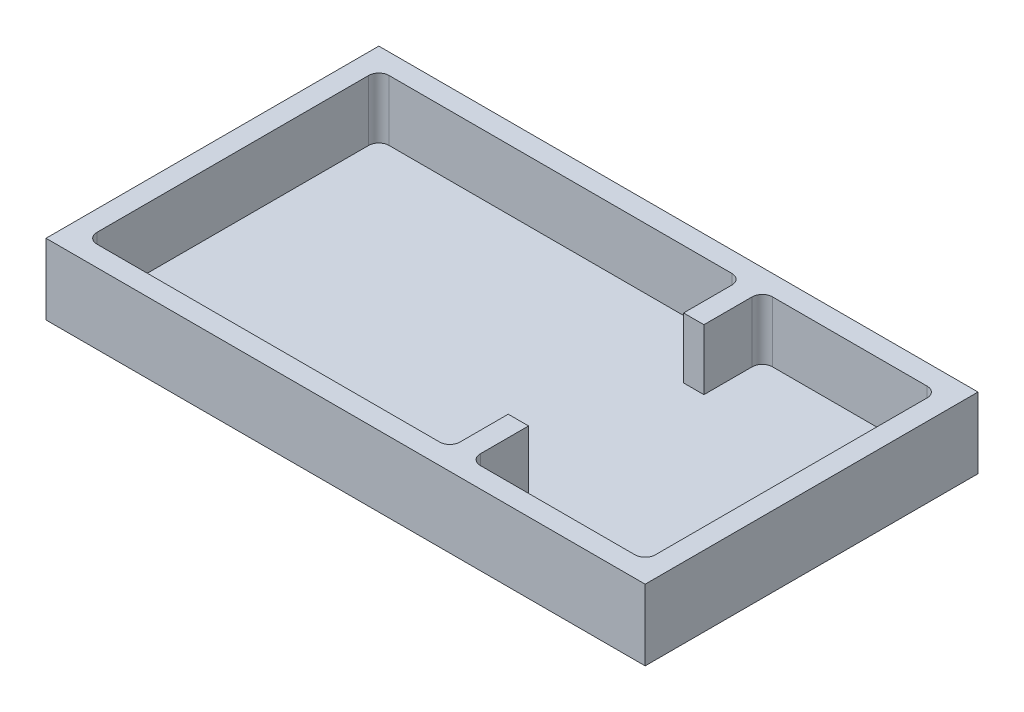
ISO-10303-21;
HEADER;
FILE_DESCRIPTION(('STEP AP214'),'2;1');
FILE_NAME('part.step','',(''),(''),'','','');
FILE_SCHEMA(('AUTOMOTIVE_DESIGN { 1 0 10303 214 1 1 1 1 }'));
ENDSEC;
DATA;
#1=APPLICATION_CONTEXT('core data for automotive mechanical design processes');
#2=APPLICATION_PROTOCOL_DEFINITION('international standard','automotive_design',2000,#1);
#3=PRODUCT_CONTEXT('',#1,'mechanical');
#4=PRODUCT('Part','Part','',(#3));
#5=PRODUCT_RELATED_PRODUCT_CATEGORY('part','',(#4));
#6=PRODUCT_DEFINITION_FORMATION('','',#4);
#7=PRODUCT_DEFINITION_CONTEXT('part definition',#1,'design');
#8=PRODUCT_DEFINITION('design','',#6,#7);
#9=PRODUCT_DEFINITION_SHAPE('','',#8);
#10=(LENGTH_UNIT() NAMED_UNIT(*) SI_UNIT(.MILLI.,.METRE.));
#11=(NAMED_UNIT(*) PLANE_ANGLE_UNIT() SI_UNIT($,.RADIAN.));
#12=(NAMED_UNIT(*) SI_UNIT($,.STERADIAN.) SOLID_ANGLE_UNIT());
#13=UNCERTAINTY_MEASURE_WITH_UNIT(LENGTH_MEASURE(1.E-05),#10,'distance_accuracy_value','');
#14=(GEOMETRIC_REPRESENTATION_CONTEXT(3) GLOBAL_UNCERTAINTY_ASSIGNED_CONTEXT((#13)) GLOBAL_UNIT_ASSIGNED_CONTEXT((#10,
#11,#12)) REPRESENTATION_CONTEXT('',''));
#15=CARTESIAN_POINT('',(0.,0.,0.));
#16=DIRECTION('',(0.,0.,1.));
#17=DIRECTION('',(1.,0.,0.));
#18=AXIS2_PLACEMENT_3D('',#15,#16,#17);
#19=CARTESIAN_POINT('',(0.,18.923,-103.910500649562));
#20=DIRECTION('',(0.,-1.,0.));
#21=DIRECTION('',(0.,0.,-1.));
#22=AXIS2_PLACEMENT_3D('',#19,#20,#21);
#23=PLANE('',#22);
#24=DIRECTION('',(0.,0.,1.));
#25=VECTOR('',#24,1.);
#26=CARTESIAN_POINT('',(0.,18.923,0.));
#27=LINE('',#26,#25);
#28=CARTESIAN_POINT('',(0.,18.923,-103.910500649562));
#29=VERTEX_POINT('',#28);
#30=CARTESIAN_POINT('',(0.,18.923,0.));
#31=VERTEX_POINT('',#30);
#32=EDGE_CURVE('E356',#29,#31,#27,.T.);
#33=ORIENTED_EDGE('',*,*,#32,.T.);
#34=DIRECTION('',(1.,0.,0.));
#35=VECTOR('',#34,1.);
#36=CARTESIAN_POINT('',(0.,18.923,0.));
#37=LINE('',#36,#35);
#38=CARTESIAN_POINT('',(187.051787580175,18.923,0.));
#39=VERTEX_POINT('',#38);
#40=EDGE_CURVE('E196',#31,#39,#37,.T.);
#41=ORIENTED_EDGE('',*,*,#40,.T.);
#42=DIRECTION('',(0.,0.,-1.));
#43=VECTOR('',#42,1.);
#44=CARTESIAN_POINT('',(187.051787580175,18.923,0.));
#45=LINE('',#44,#43);
#46=CARTESIAN_POINT('',(187.051787580175,18.923,-103.910500649562));
#47=VERTEX_POINT('',#46);
#48=EDGE_CURVE('E359',#39,#47,#45,.T.);
#49=ORIENTED_EDGE('',*,*,#48,.T.);
#50=DIRECTION('',(-1.,0.,0.));
#51=VECTOR('',#50,1.);
#52=CARTESIAN_POINT('',(0.,18.923,-103.910500649562));
#53=LINE('',#52,#51);
#54=EDGE_CURVE('E54',#47,#29,#53,.T.);
#55=ORIENTED_EDGE('',*,*,#54,.T.);
#56=EDGE_LOOP('',(#33,#41,#49,#55));
#57=FACE_BOUND('',#56,.T.);
#58=CARTESIAN_POINT('',(116.541319733707,18.923,-94.3855006495616));
#59=DIRECTION('',(0.,1.,0.));
#60=DIRECTION('',(0.,0.,1.));
#61=AXIS2_PLACEMENT_3D('',#58,#59,#60);
#62=CIRCLE('',#61,3.175);
#63=CARTESIAN_POINT('',(119.716319733707,18.923,-94.3855006495616));
#64=VERTEX_POINT('',#63);
#65=CARTESIAN_POINT('',(116.541319733707,18.923,-97.5605006495616));
#66=VERTEX_POINT('',#65);
#67=EDGE_CURVE('E217',#64,#66,#62,.T.);
#68=ORIENTED_EDGE('',*,*,#67,.F.);
#69=DIRECTION('',(0.,0.,-1.));
#70=VECTOR('',#69,1.);
#71=CARTESIAN_POINT('',(119.716319733707,18.923,-94.3855006495616));
#72=LINE('',#71,#70);
#73=CARTESIAN_POINT('',(119.716319733707,18.923,-79.325148105454));
#74=VERTEX_POINT('',#73);
#75=EDGE_CURVE('E256',#74,#64,#72,.T.);
#76=ORIENTED_EDGE('',*,*,#75,.F.);
#77=DIRECTION('',(-1.,0.,0.));
#78=VECTOR('',#77,1.);
#79=CARTESIAN_POINT('',(126.066319733707,18.923,-79.325148105454));
#80=LINE('',#79,#78);
#81=CARTESIAN_POINT('',(126.066319733707,18.923,-79.325148105454));
#82=VERTEX_POINT('',#81);
#83=EDGE_CURVE('E254',#82,#74,#80,.T.);
#84=ORIENTED_EDGE('',*,*,#83,.F.);
#85=DIRECTION('',(0.,0.,1.));
#86=VECTOR('',#85,1.);
#87=CARTESIAN_POINT('',(126.066319733707,18.923,-94.3855006495616));
#88=LINE('',#87,#86);
#89=CARTESIAN_POINT('',(126.066319733707,18.923,-94.3855006495616));
#90=VERTEX_POINT('',#89);
#91=EDGE_CURVE('E252',#90,#82,#88,.T.);
#92=ORIENTED_EDGE('',*,*,#91,.F.);
#93=CARTESIAN_POINT('',(129.241319733707,18.923,-94.3855006495616));
#94=DIRECTION('',(0.,1.,0.));
#95=DIRECTION('',(0.,0.,1.));
#96=AXIS2_PLACEMENT_3D('',#93,#94,#95);
#97=CIRCLE('',#96,3.175);
#98=CARTESIAN_POINT('',(129.241319733707,18.923,-97.5605006495616));
#99=VERTEX_POINT('',#98);
#100=EDGE_CURVE('E250',#99,#90,#97,.T.);
#101=ORIENTED_EDGE('',*,*,#100,.F.);
#102=DIRECTION('',(-1.,0.,0.));
#103=VECTOR('',#102,1.);
#104=CARTESIAN_POINT('',(129.241319733707,18.923,-97.5605006495616));
#105=LINE('',#104,#103);
#106=CARTESIAN_POINT('',(177.526787580175,18.923,-97.5605006495616));
#107=VERTEX_POINT('',#106);
#108=EDGE_CURVE('E248',#107,#99,#105,.T.);
#109=ORIENTED_EDGE('',*,*,#108,.F.);
#110=CARTESIAN_POINT('',(177.526787580175,18.923,-94.3855006495616));
#111=DIRECTION('',(0.,1.,0.));
#112=DIRECTION('',(0.,0.,1.));
#113=AXIS2_PLACEMENT_3D('',#110,#111,#112);
#114=CIRCLE('',#113,3.175);
#115=CARTESIAN_POINT('',(180.701787580175,18.923,-94.3855006495616));
#116=VERTEX_POINT('',#115);
#117=EDGE_CURVE('E246',#116,#107,#114,.T.);
#118=ORIENTED_EDGE('',*,*,#117,.F.);
#119=DIRECTION('',(0.,0.,-1.));
#120=VECTOR('',#119,1.);
#121=CARTESIAN_POINT('',(180.701787580175,18.923,-9.52500000000002));
#122=LINE('',#121,#120);
#123=CARTESIAN_POINT('',(180.701787580175,18.923,-9.52500000000002));
#124=VERTEX_POINT('',#123);
#125=EDGE_CURVE('E244',#124,#116,#122,.T.);
#126=ORIENTED_EDGE('',*,*,#125,.F.);
#127=CARTESIAN_POINT('',(177.526787580175,18.923,-9.525));
#128=DIRECTION('',(0.,1.,0.));
#129=DIRECTION('',(0.,0.,-1.));
#130=AXIS2_PLACEMENT_3D('',#127,#128,#129);
#131=CIRCLE('',#130,3.17500000000001);
#132=CARTESIAN_POINT('',(177.526787580175,18.923,-6.34999999999999));
#133=VERTEX_POINT('',#132);
#134=EDGE_CURVE('E242',#133,#124,#131,.T.);
#135=ORIENTED_EDGE('',*,*,#134,.F.);
#136=DIRECTION('',(1.,0.,0.));
#137=VECTOR('',#136,1.);
#138=CARTESIAN_POINT('',(129.241319733707,18.923,-6.34999999999999));
#139=LINE('',#138,#137);
#140=CARTESIAN_POINT('',(129.241319733707,18.923,-6.34999999999999));
#141=VERTEX_POINT('',#140);
#142=EDGE_CURVE('E240',#141,#133,#139,.T.);
#143=ORIENTED_EDGE('',*,*,#142,.F.);
#144=CARTESIAN_POINT('',(129.241319733707,18.923,-9.52499999999999));
#145=DIRECTION('',(0.,1.,0.));
#146=DIRECTION('',(0.,0.,-1.));
#147=AXIS2_PLACEMENT_3D('',#144,#145,#146);
#148=CIRCLE('',#147,3.175);
#149=CARTESIAN_POINT('',(126.066319733707,18.923,-9.52500000000002));
#150=VERTEX_POINT('',#149);
#151=EDGE_CURVE('E238',#150,#141,#148,.T.);
#152=ORIENTED_EDGE('',*,*,#151,.F.);
#153=DIRECTION('',(0.,0.,1.));
#154=VECTOR('',#153,1.);
#155=CARTESIAN_POINT('',(126.066319733707,18.923,-9.52500000000002));
#156=LINE('',#155,#154);
#157=CARTESIAN_POINT('',(126.066319733707,18.923,-24.5853525441077));
#158=VERTEX_POINT('',#157);
#159=EDGE_CURVE('E236',#158,#150,#156,.T.);
#160=ORIENTED_EDGE('',*,*,#159,.F.);
#161=DIRECTION('',(1.,0.,0.));
#162=VECTOR('',#161,1.);
#163=CARTESIAN_POINT('',(126.066319733707,18.923,-24.5853525441077));
#164=LINE('',#163,#162);
#165=CARTESIAN_POINT('',(119.716319733707,18.923,-24.5853525441077));
#166=VERTEX_POINT('',#165);
#167=EDGE_CURVE('E234',#166,#158,#164,.T.);
#168=ORIENTED_EDGE('',*,*,#167,.F.);
#169=DIRECTION('',(0.,0.,-1.));
#170=VECTOR('',#169,1.);
#171=CARTESIAN_POINT('',(119.716319733707,18.923,-9.52500000000002));
#172=LINE('',#171,#170);
#173=CARTESIAN_POINT('',(119.716319733707,18.923,-9.52500000000002));
#174=VERTEX_POINT('',#173);
#175=EDGE_CURVE('E232',#174,#166,#172,.T.);
#176=ORIENTED_EDGE('',*,*,#175,.F.);
#177=CARTESIAN_POINT('',(116.541319733707,18.923,-9.52499999999999));
#178=DIRECTION('',(0.,1.,0.));
#179=DIRECTION('',(0.,0.,-1.));
#180=AXIS2_PLACEMENT_3D('',#177,#178,#179);
#181=CIRCLE('',#180,3.175);
#182=CARTESIAN_POINT('',(116.541319733707,18.923,-6.34999999999999));
#183=VERTEX_POINT('',#182);
#184=EDGE_CURVE('E230',#183,#174,#181,.T.);
#185=ORIENTED_EDGE('',*,*,#184,.F.);
#186=DIRECTION('',(1.,0.,0.));
#187=VECTOR('',#186,1.);
#188=CARTESIAN_POINT('',(9.52500000000002,18.923,-6.35));
#189=LINE('',#188,#187);
#190=CARTESIAN_POINT('',(9.52500000000002,18.923,-6.35));
#191=VERTEX_POINT('',#190);
#192=EDGE_CURVE('E228',#191,#183,#189,.T.);
#193=ORIENTED_EDGE('',*,*,#192,.F.);
#194=CARTESIAN_POINT('',(9.525,18.923,-9.525));
#195=DIRECTION('',(0.,1.,0.));
#196=DIRECTION('',(0.,0.,-1.));
#197=AXIS2_PLACEMENT_3D('',#194,#195,#196);
#198=CIRCLE('',#197,3.175);
#199=CARTESIAN_POINT('',(6.35,18.923,-9.52500000000002));
#200=VERTEX_POINT('',#199);
#201=EDGE_CURVE('E226',#200,#191,#198,.T.);
#202=ORIENTED_EDGE('',*,*,#201,.F.);
#203=DIRECTION('',(0.,0.,1.));
#204=VECTOR('',#203,1.);
#205=CARTESIAN_POINT('',(6.35,18.923,-9.52500000000002));
#206=LINE('',#205,#204);
#207=CARTESIAN_POINT('',(6.35,18.923,-94.3855006495616));
#208=VERTEX_POINT('',#207);
#209=EDGE_CURVE('E224',#208,#200,#206,.T.);
#210=ORIENTED_EDGE('',*,*,#209,.F.);
#211=CARTESIAN_POINT('',(9.525,18.923,-94.3855006495616));
#212=DIRECTION('',(0.,1.,0.));
#213=DIRECTION('',(0.,0.,-1.));
#214=AXIS2_PLACEMENT_3D('',#211,#212,#213);
#215=CIRCLE('',#214,3.175);
#216=CARTESIAN_POINT('',(9.52500000000003,18.923,-97.5605006495616));
#217=VERTEX_POINT('',#216);
#218=EDGE_CURVE('E222',#217,#208,#215,.T.);
#219=ORIENTED_EDGE('',*,*,#218,.F.);
#220=DIRECTION('',(-1.,0.,0.));
#221=VECTOR('',#220,1.);
#222=CARTESIAN_POINT('',(9.52500000000002,18.923,-97.5605006495616));
#223=LINE('',#222,#221);
#224=EDGE_CURVE('E219',#66,#217,#223,.T.);
#225=ORIENTED_EDGE('',*,*,#224,.F.);
#226=EDGE_LOOP('',(#68,#76,#84,#92,#101,#109,#118,#126,#135,#143,#152,#160,#168,#176,#185,#193,
#202,#210,#219,#225));
#227=FACE_BOUND('',#226,.T.);
#228=ADVANCED_FACE('F31',(#57,#227),#23,.F.);
#229=CARTESIAN_POINT('',(0.,18.923,0.));
#230=DIRECTION('',(1.,0.,0.));
#231=DIRECTION('',(0.,0.,-1.));
#232=AXIS2_PLACEMENT_3D('',#229,#230,#231);
#233=PLANE('',#232);
#234=DIRECTION('',(0.,-1.,0.));
#235=VECTOR('',#234,1.);
#236=CARTESIAN_POINT('',(0.,18.923,-103.910500649562));
#237=LINE('',#236,#235);
#238=CARTESIAN_POINT('',(0.,-3.175,-103.910500649562));
#239=VERTEX_POINT('',#238);
#240=EDGE_CURVE('E210',#29,#239,#237,.T.);
#241=ORIENTED_EDGE('',*,*,#240,.T.);
#242=DIRECTION('',(0.,0.,1.));
#243=VECTOR('',#242,1.);
#244=CARTESIAN_POINT('',(0.,-3.175,-103.910500649562));
#245=LINE('',#244,#243);
#246=CARTESIAN_POINT('',(0.,-3.175,0.));
#247=VERTEX_POINT('',#246);
#248=EDGE_CURVE('E205',#239,#247,#245,.T.);
#249=ORIENTED_EDGE('',*,*,#248,.T.);
#250=DIRECTION('',(0.,-1.,0.));
#251=VECTOR('',#250,1.);
#252=CARTESIAN_POINT('',(0.,18.923,0.));
#253=LINE('',#252,#251);
#254=EDGE_CURVE('E11',#31,#247,#253,.T.);
#255=ORIENTED_EDGE('',*,*,#254,.F.);
#256=ORIENTED_EDGE('',*,*,#32,.F.);
#257=EDGE_LOOP('',(#241,#249,#255,#256));
#258=FACE_BOUND('',#257,.T.);
#259=ADVANCED_FACE('F33',(#258),#233,.F.);
#260=CARTESIAN_POINT('',(0.,18.923,0.));
#261=DIRECTION('',(0.,0.,-1.));
#262=DIRECTION('',(-1.,0.,0.));
#263=AXIS2_PLACEMENT_3D('',#260,#261,#262);
#264=PLANE('',#263);
#265=ORIENTED_EDGE('',*,*,#254,.T.);
#266=DIRECTION('',(1.,0.,0.));
#267=VECTOR('',#266,1.);
#268=CARTESIAN_POINT('',(0.,-3.175,0.));
#269=LINE('',#268,#267);
#270=CARTESIAN_POINT('',(187.051787580175,-3.175,0.));
#271=VERTEX_POINT('',#270);
#272=EDGE_CURVE('E195',#247,#271,#269,.T.);
#273=ORIENTED_EDGE('',*,*,#272,.T.);
#274=DIRECTION('',(0.,-1.,0.));
#275=VECTOR('',#274,1.);
#276=CARTESIAN_POINT('',(187.051787580175,18.923,0.));
#277=LINE('',#276,#275);
#278=EDGE_CURVE('E39',#39,#271,#277,.T.);
#279=ORIENTED_EDGE('',*,*,#278,.F.);
#280=ORIENTED_EDGE('',*,*,#40,.F.);
#281=EDGE_LOOP('',(#265,#273,#279,#280));
#282=FACE_BOUND('',#281,.T.);
#283=ADVANCED_FACE('F193',(#282),#264,.F.);
#284=CARTESIAN_POINT('',(187.051787580175,18.923,0.));
#285=DIRECTION('',(-1.,0.,0.));
#286=DIRECTION('',(0.,0.,1.));
#287=AXIS2_PLACEMENT_3D('',#284,#285,#286);
#288=PLANE('',#287);
#289=ORIENTED_EDGE('',*,*,#278,.T.);
#290=DIRECTION('',(0.,0.,-1.));
#291=VECTOR('',#290,1.);
#292=CARTESIAN_POINT('',(187.051787580175,-3.175,-103.910500649562));
#293=LINE('',#292,#291);
#294=CARTESIAN_POINT('',(187.051787580175,-3.175,-103.910500649562));
#295=VERTEX_POINT('',#294);
#296=EDGE_CURVE('E208',#271,#295,#293,.T.);
#297=ORIENTED_EDGE('',*,*,#296,.T.);
#298=DIRECTION('',(0.,-1.,0.));
#299=VECTOR('',#298,1.);
#300=CARTESIAN_POINT('',(187.051787580175,18.923,-103.910500649562));
#301=LINE('',#300,#299);
#302=EDGE_CURVE('E363',#47,#295,#301,.T.);
#303=ORIENTED_EDGE('',*,*,#302,.F.);
#304=ORIENTED_EDGE('',*,*,#48,.F.);
#305=EDGE_LOOP('',(#289,#297,#303,#304));
#306=FACE_BOUND('',#305,.T.);
#307=ADVANCED_FACE('F366',(#306),#288,.F.);
#308=CARTESIAN_POINT('',(0.,18.923,-103.910500649562));
#309=DIRECTION('',(0.,0.,1.));
#310=DIRECTION('',(1.,0.,0.));
#311=AXIS2_PLACEMENT_3D('',#308,#309,#310);
#312=PLANE('',#311);
#313=ORIENTED_EDGE('',*,*,#302,.T.);
#314=DIRECTION('',(-1.,0.,0.));
#315=VECTOR('',#314,1.);
#316=CARTESIAN_POINT('',(0.,-3.175,-103.910500649562));
#317=LINE('',#316,#315);
#318=EDGE_CURVE('E214',#295,#239,#317,.T.);
#319=ORIENTED_EDGE('',*,*,#318,.T.);
#320=ORIENTED_EDGE('',*,*,#240,.F.);
#321=ORIENTED_EDGE('',*,*,#54,.F.);
#322=EDGE_LOOP('',(#313,#319,#320,#321));
#323=FACE_BOUND('',#322,.T.);
#324=ADVANCED_FACE('F468',(#323),#312,.F.);
#325=CARTESIAN_POINT('',(116.541319733707,18.923,-94.3855006495616));
#326=DIRECTION('',(0.,-1.,0.));
#327=DIRECTION('',(0.,0.,-1.));
#328=AXIS2_PLACEMENT_3D('',#325,#326,#327);
#329=CYLINDRICAL_SURFACE('',#328,3.175);
#330=CARTESIAN_POINT('',(116.541319733707,0.,-94.3855006495616));
#331=DIRECTION('',(0.,1.,0.));
#332=DIRECTION('',(0.,0.,1.));
#333=AXIS2_PLACEMENT_3D('',#330,#331,#332);
#334=CIRCLE('',#333,3.175);
#335=CARTESIAN_POINT('',(119.716319733707,0.,-94.3855006495616));
#336=VERTEX_POINT('',#335);
#337=CARTESIAN_POINT('',(116.541319733707,0.,-97.5605006495616));
#338=VERTEX_POINT('',#337);
#339=EDGE_CURVE('E216',#336,#338,#334,.T.);
#340=ORIENTED_EDGE('',*,*,#339,.F.);
#341=DIRECTION('',(0.,-1.,0.));
#342=VECTOR('',#341,1.);
#343=CARTESIAN_POINT('',(119.716319733707,18.923,-94.3855006495616));
#344=LINE('',#343,#342);
#345=EDGE_CURVE('E258',#64,#336,#344,.T.);
#346=ORIENTED_EDGE('',*,*,#345,.F.);
#347=ORIENTED_EDGE('',*,*,#67,.T.);
#348=DIRECTION('',(0.,-1.,0.));
#349=VECTOR('',#348,1.);
#350=CARTESIAN_POINT('',(116.541319733707,18.923,-97.5605006495616));
#351=LINE('',#350,#349);
#352=EDGE_CURVE('E353',#66,#338,#351,.T.);
#353=ORIENTED_EDGE('',*,*,#352,.T.);
#354=EDGE_LOOP('',(#340,#346,#347,#353));
#355=FACE_BOUND('',#354,.T.);
#356=ADVANCED_FACE('F380',(#355),#329,.F.);
#357=CARTESIAN_POINT('',(9.52500000000002,18.923,-97.5605006495616));
#358=DIRECTION('',(0.,0.,1.));
#359=DIRECTION('',(1.,0.,0.));
#360=AXIS2_PLACEMENT_3D('',#357,#358,#359);
#361=PLANE('',#360);
#362=DIRECTION('',(-1.,0.,0.));
#363=VECTOR('',#362,1.);
#364=CARTESIAN_POINT('',(9.52500000000002,0.,-97.5605006495616));
#365=LINE('',#364,#363);
#366=CARTESIAN_POINT('',(9.52500000000003,0.,-97.5605006495616));
#367=VERTEX_POINT('',#366);
#368=EDGE_CURVE('E261',#338,#367,#365,.T.);
#369=ORIENTED_EDGE('',*,*,#368,.F.);
#370=ORIENTED_EDGE('',*,*,#352,.F.);
#371=ORIENTED_EDGE('',*,*,#224,.T.);
#372=DIRECTION('',(0.,-1.,0.));
#373=VECTOR('',#372,1.);
#374=CARTESIAN_POINT('',(9.52500000000003,18.923,-97.5605006495616));
#375=LINE('',#374,#373);
#376=EDGE_CURVE('E351',#217,#367,#375,.T.);
#377=ORIENTED_EDGE('',*,*,#376,.T.);
#378=EDGE_LOOP('',(#369,#370,#371,#377));
#379=FACE_BOUND('',#378,.T.);
#380=ADVANCED_FACE('F382',(#379),#361,.T.);
#381=CARTESIAN_POINT('',(9.525,18.923,-94.3855006495616));
#382=DIRECTION('',(0.,-1.,0.));
#383=DIRECTION('',(0.,0.,-1.));
#384=AXIS2_PLACEMENT_3D('',#381,#382,#383);
#385=CYLINDRICAL_SURFACE('',#384,3.175);
#386=CARTESIAN_POINT('',(9.525,0.,-94.3855006495616));
#387=DIRECTION('',(0.,1.,0.));
#388=DIRECTION('',(0.,0.,-1.));
#389=AXIS2_PLACEMENT_3D('',#386,#387,#388);
#390=CIRCLE('',#389,3.175);
#391=CARTESIAN_POINT('',(6.35,0.,-94.3855006495616));
#392=VERTEX_POINT('',#391);
#393=EDGE_CURVE('E264',#367,#392,#390,.T.);
#394=ORIENTED_EDGE('',*,*,#393,.F.);
#395=ORIENTED_EDGE('',*,*,#376,.F.);
#396=ORIENTED_EDGE('',*,*,#218,.T.);
#397=DIRECTION('',(0.,-1.,0.));
#398=VECTOR('',#397,1.);
#399=CARTESIAN_POINT('',(6.35,18.923,-94.3855006495616));
#400=LINE('',#399,#398);
#401=EDGE_CURVE('E349',#208,#392,#400,.T.);
#402=ORIENTED_EDGE('',*,*,#401,.T.);
#403=EDGE_LOOP('',(#394,#395,#396,#402));
#404=FACE_BOUND('',#403,.T.);
#405=ADVANCED_FACE('F460',(#404),#385,.F.);
#406=CARTESIAN_POINT('',(6.35,18.923,-9.52500000000002));
#407=DIRECTION('',(1.,0.,0.));
#408=DIRECTION('',(0.,0.,-1.));
#409=AXIS2_PLACEMENT_3D('',#406,#407,#408);
#410=PLANE('',#409);
#411=DIRECTION('',(0.,0.,1.));
#412=VECTOR('',#411,1.);
#413=CARTESIAN_POINT('',(6.35,0.,-9.52500000000002));
#414=LINE('',#413,#412);
#415=CARTESIAN_POINT('',(6.35,0.,-9.52500000000002));
#416=VERTEX_POINT('',#415);
#417=EDGE_CURVE('E267',#392,#416,#414,.T.);
#418=ORIENTED_EDGE('',*,*,#417,.F.);
#419=ORIENTED_EDGE('',*,*,#401,.F.);
#420=ORIENTED_EDGE('',*,*,#209,.T.);
#421=DIRECTION('',(0.,-1.,0.));
#422=VECTOR('',#421,1.);
#423=CARTESIAN_POINT('',(6.35,18.923,-9.52500000000002));
#424=LINE('',#423,#422);
#425=EDGE_CURVE('E347',#200,#416,#424,.T.);
#426=ORIENTED_EDGE('',*,*,#425,.T.);
#427=EDGE_LOOP('',(#418,#419,#420,#426));
#428=FACE_BOUND('',#427,.T.);
#429=ADVANCED_FACE('F456',(#428),#410,.T.);
#430=CARTESIAN_POINT('',(9.525,18.923,-9.525));
#431=DIRECTION('',(0.,-1.,0.));
#432=DIRECTION('',(0.,0.,-1.));
#433=AXIS2_PLACEMENT_3D('',#430,#431,#432);
#434=CYLINDRICAL_SURFACE('',#433,3.175);
#435=CARTESIAN_POINT('',(9.525,0.,-9.525));
#436=DIRECTION('',(0.,1.,0.));
#437=DIRECTION('',(0.,0.,-1.));
#438=AXIS2_PLACEMENT_3D('',#435,#436,#437);
#439=CIRCLE('',#438,3.175);
#440=CARTESIAN_POINT('',(9.52500000000002,0.,-6.35));
#441=VERTEX_POINT('',#440);
#442=EDGE_CURVE('E270',#416,#441,#439,.T.);
#443=ORIENTED_EDGE('',*,*,#442,.F.);
#444=ORIENTED_EDGE('',*,*,#425,.F.);
#445=ORIENTED_EDGE('',*,*,#201,.T.);
#446=DIRECTION('',(0.,-1.,0.));
#447=VECTOR('',#446,1.);
#448=CARTESIAN_POINT('',(9.52500000000002,18.923,-6.35));
#449=LINE('',#448,#447);
#450=EDGE_CURVE('E345',#191,#441,#449,.T.);
#451=ORIENTED_EDGE('',*,*,#450,.T.);
#452=EDGE_LOOP('',(#443,#444,#445,#451));
#453=FACE_BOUND('',#452,.T.);
#454=ADVANCED_FACE('F452',(#453),#434,.F.);
#455=CARTESIAN_POINT('',(9.52500000000002,18.923,-6.35));
#456=DIRECTION('',(0.,0.,-1.));
#457=DIRECTION('',(-1.,0.,0.));
#458=AXIS2_PLACEMENT_3D('',#455,#456,#457);
#459=PLANE('',#458);
#460=DIRECTION('',(1.,0.,0.));
#461=VECTOR('',#460,1.);
#462=CARTESIAN_POINT('',(9.52500000000002,0.,-6.35));
#463=LINE('',#462,#461);
#464=CARTESIAN_POINT('',(116.541319733707,0.,-6.34999999999999));
#465=VERTEX_POINT('',#464);
#466=EDGE_CURVE('E273',#441,#465,#463,.T.);
#467=ORIENTED_EDGE('',*,*,#466,.F.);
#468=ORIENTED_EDGE('',*,*,#450,.F.);
#469=ORIENTED_EDGE('',*,*,#192,.T.);
#470=DIRECTION('',(0.,-1.,0.));
#471=VECTOR('',#470,1.);
#472=CARTESIAN_POINT('',(116.541319733707,18.923,-6.34999999999999));
#473=LINE('',#472,#471);
#474=EDGE_CURVE('E343',#183,#465,#473,.T.);
#475=ORIENTED_EDGE('',*,*,#474,.T.);
#476=EDGE_LOOP('',(#467,#468,#469,#475));
#477=FACE_BOUND('',#476,.T.);
#478=ADVANCED_FACE('F448',(#477),#459,.T.);
#479=CARTESIAN_POINT('',(116.541319733707,18.923,-9.52499999999999));
#480=DIRECTION('',(0.,-1.,0.));
#481=DIRECTION('',(0.,0.,-1.));
#482=AXIS2_PLACEMENT_3D('',#479,#480,#481);
#483=CYLINDRICAL_SURFACE('',#482,3.175);
#484=CARTESIAN_POINT('',(116.541319733707,0.,-9.52499999999999));
#485=DIRECTION('',(0.,1.,0.));
#486=DIRECTION('',(0.,0.,-1.));
#487=AXIS2_PLACEMENT_3D('',#484,#485,#486);
#488=CIRCLE('',#487,3.175);
#489=CARTESIAN_POINT('',(119.716319733707,0.,-9.52500000000002));
#490=VERTEX_POINT('',#489);
#491=EDGE_CURVE('E276',#465,#490,#488,.T.);
#492=ORIENTED_EDGE('',*,*,#491,.F.);
#493=ORIENTED_EDGE('',*,*,#474,.F.);
#494=ORIENTED_EDGE('',*,*,#184,.T.);
#495=DIRECTION('',(0.,-1.,0.));
#496=VECTOR('',#495,1.);
#497=CARTESIAN_POINT('',(119.716319733707,18.923,-9.52500000000002));
#498=LINE('',#497,#496);
#499=EDGE_CURVE('E341',#174,#490,#498,.T.);
#500=ORIENTED_EDGE('',*,*,#499,.T.);
#501=EDGE_LOOP('',(#492,#493,#494,#500));
#502=FACE_BOUND('',#501,.T.);
#503=ADVANCED_FACE('F444',(#502),#483,.F.);
#504=CARTESIAN_POINT('',(119.716319733707,18.923,-9.52500000000002));
#505=DIRECTION('',(-1.,0.,0.));
#506=DIRECTION('',(0.,0.,1.));
#507=AXIS2_PLACEMENT_3D('',#504,#505,#506);
#508=PLANE('',#507);
#509=DIRECTION('',(0.,0.,-1.));
#510=VECTOR('',#509,1.);
#511=CARTESIAN_POINT('',(119.716319733707,0.,-9.52500000000002));
#512=LINE('',#511,#510);
#513=CARTESIAN_POINT('',(119.716319733707,0.,-24.5853525441077));
#514=VERTEX_POINT('',#513);
#515=EDGE_CURVE('E279',#490,#514,#512,.T.);
#516=ORIENTED_EDGE('',*,*,#515,.F.);
#517=ORIENTED_EDGE('',*,*,#499,.F.);
#518=ORIENTED_EDGE('',*,*,#175,.T.);
#519=DIRECTION('',(0.,-1.,0.));
#520=VECTOR('',#519,1.);
#521=CARTESIAN_POINT('',(119.716319733707,18.923,-24.5853525441077));
#522=LINE('',#521,#520);
#523=EDGE_CURVE('E339',#166,#514,#522,.T.);
#524=ORIENTED_EDGE('',*,*,#523,.T.);
#525=EDGE_LOOP('',(#516,#517,#518,#524));
#526=FACE_BOUND('',#525,.T.);
#527=ADVANCED_FACE('F440',(#526),#508,.T.);
#528=CARTESIAN_POINT('',(126.066319733707,18.923,-24.5853525441077));
#529=DIRECTION('',(0.,0.,-1.));
#530=DIRECTION('',(-1.,0.,0.));
#531=AXIS2_PLACEMENT_3D('',#528,#529,#530);
#532=PLANE('',#531);
#533=DIRECTION('',(1.,0.,0.));
#534=VECTOR('',#533,1.);
#535=CARTESIAN_POINT('',(126.066319733707,0.,-24.5853525441077));
#536=LINE('',#535,#534);
#537=CARTESIAN_POINT('',(126.066319733707,0.,-24.5853525441077));
#538=VERTEX_POINT('',#537);
#539=EDGE_CURVE('E282',#514,#538,#536,.T.);
#540=ORIENTED_EDGE('',*,*,#539,.F.);
#541=ORIENTED_EDGE('',*,*,#523,.F.);
#542=ORIENTED_EDGE('',*,*,#167,.T.);
#543=DIRECTION('',(0.,-1.,0.));
#544=VECTOR('',#543,1.);
#545=CARTESIAN_POINT('',(126.066319733707,18.923,-24.5853525441077));
#546=LINE('',#545,#544);
#547=EDGE_CURVE('E337',#158,#538,#546,.T.);
#548=ORIENTED_EDGE('',*,*,#547,.T.);
#549=EDGE_LOOP('',(#540,#541,#542,#548));
#550=FACE_BOUND('',#549,.T.);
#551=ADVANCED_FACE('F436',(#550),#532,.T.);
#552=CARTESIAN_POINT('',(126.066319733707,18.923,-9.52500000000002));
#553=DIRECTION('',(1.,0.,0.));
#554=DIRECTION('',(0.,0.,-1.));
#555=AXIS2_PLACEMENT_3D('',#552,#553,#554);
#556=PLANE('',#555);
#557=DIRECTION('',(0.,0.,1.));
#558=VECTOR('',#557,1.);
#559=CARTESIAN_POINT('',(126.066319733707,0.,-9.52500000000002));
#560=LINE('',#559,#558);
#561=CARTESIAN_POINT('',(126.066319733707,0.,-9.52500000000002));
#562=VERTEX_POINT('',#561);
#563=EDGE_CURVE('E285',#538,#562,#560,.T.);
#564=ORIENTED_EDGE('',*,*,#563,.F.);
#565=ORIENTED_EDGE('',*,*,#547,.F.);
#566=ORIENTED_EDGE('',*,*,#159,.T.);
#567=DIRECTION('',(0.,-1.,0.));
#568=VECTOR('',#567,1.);
#569=CARTESIAN_POINT('',(126.066319733707,18.923,-9.52500000000002));
#570=LINE('',#569,#568);
#571=EDGE_CURVE('E335',#150,#562,#570,.T.);
#572=ORIENTED_EDGE('',*,*,#571,.T.);
#573=EDGE_LOOP('',(#564,#565,#566,#572));
#574=FACE_BOUND('',#573,.T.);
#575=ADVANCED_FACE('F432',(#574),#556,.T.);
#576=CARTESIAN_POINT('',(129.241319733707,18.923,-9.52499999999999));
#577=DIRECTION('',(0.,-1.,0.));
#578=DIRECTION('',(0.,0.,-1.));
#579=AXIS2_PLACEMENT_3D('',#576,#577,#578);
#580=CYLINDRICAL_SURFACE('',#579,3.175);
#581=CARTESIAN_POINT('',(129.241319733707,0.,-9.52499999999999));
#582=DIRECTION('',(0.,1.,0.));
#583=DIRECTION('',(0.,0.,-1.));
#584=AXIS2_PLACEMENT_3D('',#581,#582,#583);
#585=CIRCLE('',#584,3.175);
#586=CARTESIAN_POINT('',(129.241319733707,0.,-6.34999999999999));
#587=VERTEX_POINT('',#586);
#588=EDGE_CURVE('E288',#562,#587,#585,.T.);
#589=ORIENTED_EDGE('',*,*,#588,.F.);
#590=ORIENTED_EDGE('',*,*,#571,.F.);
#591=ORIENTED_EDGE('',*,*,#151,.T.);
#592=DIRECTION('',(0.,-1.,0.));
#593=VECTOR('',#592,1.);
#594=CARTESIAN_POINT('',(129.241319733707,18.923,-6.34999999999999));
#595=LINE('',#594,#593);
#596=EDGE_CURVE('E333',#141,#587,#595,.T.);
#597=ORIENTED_EDGE('',*,*,#596,.T.);
#598=EDGE_LOOP('',(#589,#590,#591,#597));
#599=FACE_BOUND('',#598,.T.);
#600=ADVANCED_FACE('F428',(#599),#580,.F.);
#601=CARTESIAN_POINT('',(129.241319733707,18.923,-6.34999999999999));
#602=DIRECTION('',(0.,0.,-1.));
#603=DIRECTION('',(-1.,0.,0.));
#604=AXIS2_PLACEMENT_3D('',#601,#602,#603);
#605=PLANE('',#604);
#606=DIRECTION('',(1.,0.,0.));
#607=VECTOR('',#606,1.);
#608=CARTESIAN_POINT('',(129.241319733707,0.,-6.34999999999999));
#609=LINE('',#608,#607);
#610=CARTESIAN_POINT('',(177.526787580175,0.,-6.34999999999999));
#611=VERTEX_POINT('',#610);
#612=EDGE_CURVE('E291',#587,#611,#609,.T.);
#613=ORIENTED_EDGE('',*,*,#612,.F.);
#614=ORIENTED_EDGE('',*,*,#596,.F.);
#615=ORIENTED_EDGE('',*,*,#142,.T.);
#616=DIRECTION('',(0.,-1.,0.));
#617=VECTOR('',#616,1.);
#618=CARTESIAN_POINT('',(177.526787580175,18.923,-6.34999999999999));
#619=LINE('',#618,#617);
#620=EDGE_CURVE('E331',#133,#611,#619,.T.);
#621=ORIENTED_EDGE('',*,*,#620,.T.);
#622=EDGE_LOOP('',(#613,#614,#615,#621));
#623=FACE_BOUND('',#622,.T.);
#624=ADVANCED_FACE('F424',(#623),#605,.T.);
#625=CARTESIAN_POINT('',(177.526787580175,18.923,-9.525));
#626=DIRECTION('',(0.,-1.,0.));
#627=DIRECTION('',(0.,0.,-1.));
#628=AXIS2_PLACEMENT_3D('',#625,#626,#627);
#629=CYLINDRICAL_SURFACE('',#628,3.17500000000001);
#630=CARTESIAN_POINT('',(177.526787580175,0.,-9.525));
#631=DIRECTION('',(0.,1.,0.));
#632=DIRECTION('',(0.,0.,-1.));
#633=AXIS2_PLACEMENT_3D('',#630,#631,#632);
#634=CIRCLE('',#633,3.17500000000001);
#635=CARTESIAN_POINT('',(180.701787580175,0.,-9.52500000000002));
#636=VERTEX_POINT('',#635);
#637=EDGE_CURVE('E294',#611,#636,#634,.T.);
#638=ORIENTED_EDGE('',*,*,#637,.F.);
#639=ORIENTED_EDGE('',*,*,#620,.F.);
#640=ORIENTED_EDGE('',*,*,#134,.T.);
#641=DIRECTION('',(0.,-1.,0.));
#642=VECTOR('',#641,1.);
#643=CARTESIAN_POINT('',(180.701787580175,18.923,-9.52500000000002));
#644=LINE('',#643,#642);
#645=EDGE_CURVE('E329',#124,#636,#644,.T.);
#646=ORIENTED_EDGE('',*,*,#645,.T.);
#647=EDGE_LOOP('',(#638,#639,#640,#646));
#648=FACE_BOUND('',#647,.T.);
#649=ADVANCED_FACE('F420',(#648),#629,.F.);
#650=CARTESIAN_POINT('',(180.701787580175,18.923,-9.52500000000002));
#651=DIRECTION('',(-1.,0.,0.));
#652=DIRECTION('',(0.,0.,1.));
#653=AXIS2_PLACEMENT_3D('',#650,#651,#652);
#654=PLANE('',#653);
#655=DIRECTION('',(0.,0.,-1.));
#656=VECTOR('',#655,1.);
#657=CARTESIAN_POINT('',(180.701787580175,0.,-9.52500000000002));
#658=LINE('',#657,#656);
#659=CARTESIAN_POINT('',(180.701787580175,0.,-94.3855006495616));
#660=VERTEX_POINT('',#659);
#661=EDGE_CURVE('E297',#636,#660,#658,.T.);
#662=ORIENTED_EDGE('',*,*,#661,.F.);
#663=ORIENTED_EDGE('',*,*,#645,.F.);
#664=ORIENTED_EDGE('',*,*,#125,.T.);
#665=DIRECTION('',(0.,-1.,0.));
#666=VECTOR('',#665,1.);
#667=CARTESIAN_POINT('',(180.701787580175,18.923,-94.3855006495616));
#668=LINE('',#667,#666);
#669=EDGE_CURVE('E327',#116,#660,#668,.T.);
#670=ORIENTED_EDGE('',*,*,#669,.T.);
#671=EDGE_LOOP('',(#662,#663,#664,#670));
#672=FACE_BOUND('',#671,.T.);
#673=ADVANCED_FACE('F416',(#672),#654,.T.);
#674=CARTESIAN_POINT('',(177.526787580175,18.923,-94.3855006495616));
#675=DIRECTION('',(0.,-1.,0.));
#676=DIRECTION('',(0.,0.,-1.));
#677=AXIS2_PLACEMENT_3D('',#674,#675,#676);
#678=CYLINDRICAL_SURFACE('',#677,3.175);
#679=CARTESIAN_POINT('',(177.526787580175,0.,-94.3855006495616));
#680=DIRECTION('',(0.,1.,0.));
#681=DIRECTION('',(0.,0.,1.));
#682=AXIS2_PLACEMENT_3D('',#679,#680,#681);
#683=CIRCLE('',#682,3.175);
#684=CARTESIAN_POINT('',(177.526787580175,0.,-97.5605006495616));
#685=VERTEX_POINT('',#684);
#686=EDGE_CURVE('E300',#660,#685,#683,.T.);
#687=ORIENTED_EDGE('',*,*,#686,.F.);
#688=ORIENTED_EDGE('',*,*,#669,.F.);
#689=ORIENTED_EDGE('',*,*,#117,.T.);
#690=DIRECTION('',(0.,-1.,0.));
#691=VECTOR('',#690,1.);
#692=CARTESIAN_POINT('',(177.526787580175,18.923,-97.5605006495616));
#693=LINE('',#692,#691);
#694=EDGE_CURVE('E325',#107,#685,#693,.T.);
#695=ORIENTED_EDGE('',*,*,#694,.T.);
#696=EDGE_LOOP('',(#687,#688,#689,#695));
#697=FACE_BOUND('',#696,.T.);
#698=ADVANCED_FACE('F412',(#697),#678,.F.);
#699=CARTESIAN_POINT('',(129.241319733707,18.923,-97.5605006495616));
#700=DIRECTION('',(0.,0.,1.));
#701=DIRECTION('',(1.,0.,0.));
#702=AXIS2_PLACEMENT_3D('',#699,#700,#701);
#703=PLANE('',#702);
#704=DIRECTION('',(-1.,0.,0.));
#705=VECTOR('',#704,1.);
#706=CARTESIAN_POINT('',(129.241319733707,0.,-97.5605006495616));
#707=LINE('',#706,#705);
#708=CARTESIAN_POINT('',(129.241319733707,0.,-97.5605006495616));
#709=VERTEX_POINT('',#708);
#710=EDGE_CURVE('E303',#685,#709,#707,.T.);
#711=ORIENTED_EDGE('',*,*,#710,.F.);
#712=ORIENTED_EDGE('',*,*,#694,.F.);
#713=ORIENTED_EDGE('',*,*,#108,.T.);
#714=DIRECTION('',(0.,-1.,0.));
#715=VECTOR('',#714,1.);
#716=CARTESIAN_POINT('',(129.241319733707,18.923,-97.5605006495616));
#717=LINE('',#716,#715);
#718=EDGE_CURVE('E323',#99,#709,#717,.T.);
#719=ORIENTED_EDGE('',*,*,#718,.T.);
#720=EDGE_LOOP('',(#711,#712,#713,#719));
#721=FACE_BOUND('',#720,.T.);
#722=ADVANCED_FACE('F408',(#721),#703,.T.);
#723=CARTESIAN_POINT('',(129.241319733707,18.923,-94.3855006495616));
#724=DIRECTION('',(0.,-1.,0.));
#725=DIRECTION('',(0.,0.,-1.));
#726=AXIS2_PLACEMENT_3D('',#723,#724,#725);
#727=CYLINDRICAL_SURFACE('',#726,3.175);
#728=CARTESIAN_POINT('',(129.241319733707,0.,-94.3855006495616));
#729=DIRECTION('',(0.,1.,0.));
#730=DIRECTION('',(0.,0.,1.));
#731=AXIS2_PLACEMENT_3D('',#728,#729,#730);
#732=CIRCLE('',#731,3.175);
#733=CARTESIAN_POINT('',(126.066319733707,0.,-94.3855006495616));
#734=VERTEX_POINT('',#733);
#735=EDGE_CURVE('E306',#709,#734,#732,.T.);
#736=ORIENTED_EDGE('',*,*,#735,.F.);
#737=ORIENTED_EDGE('',*,*,#718,.F.);
#738=ORIENTED_EDGE('',*,*,#100,.T.);
#739=DIRECTION('',(0.,-1.,0.));
#740=VECTOR('',#739,1.);
#741=CARTESIAN_POINT('',(126.066319733707,18.923,-94.3855006495616));
#742=LINE('',#741,#740);
#743=EDGE_CURVE('E321',#90,#734,#742,.T.);
#744=ORIENTED_EDGE('',*,*,#743,.T.);
#745=EDGE_LOOP('',(#736,#737,#738,#744));
#746=FACE_BOUND('',#745,.T.);
#747=ADVANCED_FACE('F404',(#746),#727,.F.);
#748=CARTESIAN_POINT('',(126.066319733707,18.923,-94.3855006495616));
#749=DIRECTION('',(1.,0.,0.));
#750=DIRECTION('',(0.,0.,-1.));
#751=AXIS2_PLACEMENT_3D('',#748,#749,#750);
#752=PLANE('',#751);
#753=DIRECTION('',(0.,0.,1.));
#754=VECTOR('',#753,1.);
#755=CARTESIAN_POINT('',(126.066319733707,0.,-94.3855006495616));
#756=LINE('',#755,#754);
#757=CARTESIAN_POINT('',(126.066319733707,0.,-79.325148105454));
#758=VERTEX_POINT('',#757);
#759=EDGE_CURVE('E309',#734,#758,#756,.T.);
#760=ORIENTED_EDGE('',*,*,#759,.F.);
#761=ORIENTED_EDGE('',*,*,#743,.F.);
#762=ORIENTED_EDGE('',*,*,#91,.T.);
#763=DIRECTION('',(0.,-1.,0.));
#764=VECTOR('',#763,1.);
#765=CARTESIAN_POINT('',(126.066319733707,18.923,-79.325148105454));
#766=LINE('',#765,#764);
#767=EDGE_CURVE('E319',#82,#758,#766,.T.);
#768=ORIENTED_EDGE('',*,*,#767,.T.);
#769=EDGE_LOOP('',(#760,#761,#762,#768));
#770=FACE_BOUND('',#769,.T.);
#771=ADVANCED_FACE('F397',(#770),#752,.T.);
#772=CARTESIAN_POINT('',(126.066319733707,18.923,-79.325148105454));
#773=DIRECTION('',(0.,0.,1.));
#774=DIRECTION('',(1.,0.,0.));
#775=AXIS2_PLACEMENT_3D('',#772,#773,#774);
#776=PLANE('',#775);
#777=DIRECTION('',(-1.,0.,0.));
#778=VECTOR('',#777,1.);
#779=CARTESIAN_POINT('',(126.066319733707,0.,-79.325148105454));
#780=LINE('',#779,#778);
#781=CARTESIAN_POINT('',(119.716319733707,0.,-79.325148105454));
#782=VERTEX_POINT('',#781);
#783=EDGE_CURVE('E312',#758,#782,#780,.T.);
#784=ORIENTED_EDGE('',*,*,#783,.F.);
#785=ORIENTED_EDGE('',*,*,#767,.F.);
#786=ORIENTED_EDGE('',*,*,#83,.T.);
#787=DIRECTION('',(0.,-1.,0.));
#788=VECTOR('',#787,1.);
#789=CARTESIAN_POINT('',(119.716319733707,18.923,-79.325148105454));
#790=LINE('',#789,#788);
#791=EDGE_CURVE('E46',#74,#782,#790,.T.);
#792=ORIENTED_EDGE('',*,*,#791,.T.);
#793=EDGE_LOOP('',(#784,#785,#786,#792));
#794=FACE_BOUND('',#793,.T.);
#795=ADVANCED_FACE('F390',(#794),#776,.T.);
#796=CARTESIAN_POINT('',(119.716319733707,18.923,-94.3855006495616));
#797=DIRECTION('',(-1.,0.,0.));
#798=DIRECTION('',(0.,0.,1.));
#799=AXIS2_PLACEMENT_3D('',#796,#797,#798);
#800=PLANE('',#799);
#801=DIRECTION('',(0.,0.,-1.));
#802=VECTOR('',#801,1.);
#803=CARTESIAN_POINT('',(119.716319733707,0.,-94.3855006495616));
#804=LINE('',#803,#802);
#805=EDGE_CURVE('E220',#782,#336,#804,.T.);
#806=ORIENTED_EDGE('',*,*,#805,.F.);
#807=ORIENTED_EDGE('',*,*,#791,.F.);
#808=ORIENTED_EDGE('',*,*,#75,.T.);
#809=ORIENTED_EDGE('',*,*,#345,.T.);
#810=EDGE_LOOP('',(#806,#807,#808,#809));
#811=FACE_BOUND('',#810,.T.);
#812=ADVANCED_FACE('F388',(#811),#800,.T.);
#813=CARTESIAN_POINT('',(0.,0.,0.));
#814=DIRECTION('',(0.,1.,0.));
#815=DIRECTION('',(0.,0.,1.));
#816=AXIS2_PLACEMENT_3D('',#813,#814,#815);
#817=PLANE('',#816);
#818=ORIENTED_EDGE('',*,*,#805,.T.);
#819=ORIENTED_EDGE('',*,*,#339,.T.);
#820=ORIENTED_EDGE('',*,*,#368,.T.);
#821=ORIENTED_EDGE('',*,*,#393,.T.);
#822=ORIENTED_EDGE('',*,*,#417,.T.);
#823=ORIENTED_EDGE('',*,*,#442,.T.);
#824=ORIENTED_EDGE('',*,*,#466,.T.);
#825=ORIENTED_EDGE('',*,*,#491,.T.);
#826=ORIENTED_EDGE('',*,*,#515,.T.);
#827=ORIENTED_EDGE('',*,*,#539,.T.);
#828=ORIENTED_EDGE('',*,*,#563,.T.);
#829=ORIENTED_EDGE('',*,*,#588,.T.);
#830=ORIENTED_EDGE('',*,*,#612,.T.);
#831=ORIENTED_EDGE('',*,*,#637,.T.);
#832=ORIENTED_EDGE('',*,*,#661,.T.);
#833=ORIENTED_EDGE('',*,*,#686,.T.);
#834=ORIENTED_EDGE('',*,*,#710,.T.);
#835=ORIENTED_EDGE('',*,*,#735,.T.);
#836=ORIENTED_EDGE('',*,*,#759,.T.);
#837=ORIENTED_EDGE('',*,*,#783,.T.);
#838=EDGE_LOOP('',(#818,#819,#820,#821,#822,#823,#824,#825,#826,#827,#828,#829,#830,#831,#832,
#833,#834,#835,#836,#837));
#839=FACE_BOUND('',#838,.T.);
#840=ADVANCED_FACE('F386',(#839),#817,.T.);
#841=CARTESIAN_POINT('',(0.,-3.175,0.));
#842=DIRECTION('',(0.,1.,0.));
#843=DIRECTION('',(0.,0.,1.));
#844=AXIS2_PLACEMENT_3D('',#841,#842,#843);
#845=PLANE('',#844);
#846=ORIENTED_EDGE('',*,*,#248,.F.);
#847=ORIENTED_EDGE('',*,*,#318,.F.);
#848=ORIENTED_EDGE('',*,*,#296,.F.);
#849=ORIENTED_EDGE('',*,*,#272,.F.);
#850=EDGE_LOOP('',(#846,#847,#848,#849));
#851=FACE_BOUND('',#850,.T.);
#852=ADVANCED_FACE('F203',(#851),#845,.F.);
#853=CLOSED_SHELL('',(#228,#259,#283,#307,#324,#356,#380,#405,#429,#454,#478,#503,#527,#551,
#575,#600,#624,#649,#673,#698,#722,#747,#771,#795,#812,#840,#852));
#854=MANIFOLD_SOLID_BREP('B2',#853);
#855=ADVANCED_BREP_SHAPE_REPRESENTATION('',(#18,#854),#14);
#856=SHAPE_DEFINITION_REPRESENTATION(#9,#855);
ENDSEC;
END-ISO-10303-21;
